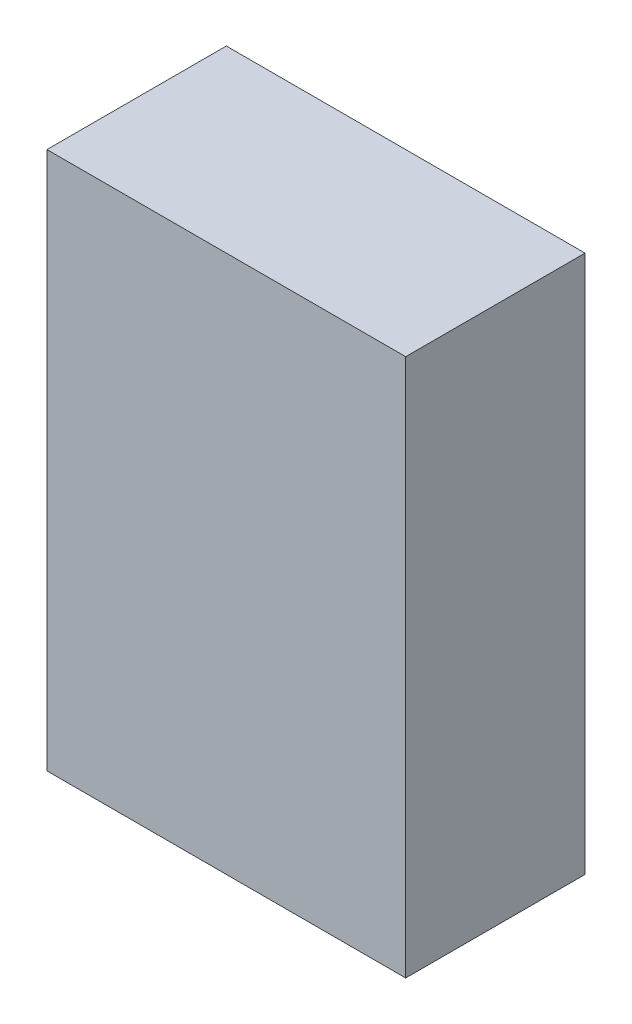
ISO-10303-21;
HEADER;
FILE_DESCRIPTION(('STEP AP214'),'2;1');
FILE_NAME('part.step','',(''),(''),'','','');
FILE_SCHEMA(('AUTOMOTIVE_DESIGN { 1 0 10303 214 1 1 1 1 }'));
ENDSEC;
DATA;
#1=APPLICATION_CONTEXT('core data for automotive mechanical design processes');
#2=APPLICATION_PROTOCOL_DEFINITION('international standard','automotive_design',2000,#1);
#3=PRODUCT_CONTEXT('',#1,'mechanical');
#4=PRODUCT('Part','Part','',(#3));
#5=PRODUCT_RELATED_PRODUCT_CATEGORY('part','',(#4));
#6=PRODUCT_DEFINITION_FORMATION('','',#4);
#7=PRODUCT_DEFINITION_CONTEXT('part definition',#1,'design');
#8=PRODUCT_DEFINITION('design','',#6,#7);
#9=PRODUCT_DEFINITION_SHAPE('','',#8);
#10=(LENGTH_UNIT() NAMED_UNIT(*) SI_UNIT(.MILLI.,.METRE.));
#11=(NAMED_UNIT(*) PLANE_ANGLE_UNIT() SI_UNIT($,.RADIAN.));
#12=(NAMED_UNIT(*) SI_UNIT($,.STERADIAN.) SOLID_ANGLE_UNIT());
#13=UNCERTAINTY_MEASURE_WITH_UNIT(LENGTH_MEASURE(1.E-05),#10,'distance_accuracy_value','');
#14=(GEOMETRIC_REPRESENTATION_CONTEXT(3) GLOBAL_UNCERTAINTY_ASSIGNED_CONTEXT((#13)) GLOBAL_UNIT_ASSIGNED_CONTEXT((#10,
#11,#12)) REPRESENTATION_CONTEXT('',''));
#15=CARTESIAN_POINT('',(0.,0.,0.));
#16=DIRECTION('',(0.,0.,1.));
#17=DIRECTION('',(1.,0.,0.));
#18=AXIS2_PLACEMENT_3D('',#15,#16,#17);
#19=CARTESIAN_POINT('',(-14.6332985749044,14.014598540146,10.));
#20=DIRECTION('',(1.,0.,0.));
#21=DIRECTION('',(0.,0.,-1.));
#22=AXIS2_PLACEMENT_3D('',#19,#20,#21);
#23=PLANE('',#22);
#24=DIRECTION('',(0.,-1.,0.));
#25=VECTOR('',#24,1.);
#26=CARTESIAN_POINT('',(-14.6332985749044,14.014598540146,0.));
#27=LINE('',#26,#25);
#28=CARTESIAN_POINT('',(-14.6332985749044,14.014598540146,0.));
#29=VERTEX_POINT('',#28);
#30=CARTESIAN_POINT('',(-14.6332985749044,-15.985401459854,0.));
#31=VERTEX_POINT('',#30);
#32=EDGE_CURVE('E98',#29,#31,#27,.T.);
#33=ORIENTED_EDGE('',*,*,#32,.T.);
#34=DIRECTION('',(0.,0.,-1.));
#35=VECTOR('',#34,1.);
#36=CARTESIAN_POINT('',(-14.6332985749044,-15.985401459854,10.));
#37=LINE('',#36,#35);
#38=CARTESIAN_POINT('',(-14.6332985749044,-15.985401459854,10.));
#39=VERTEX_POINT('',#38);
#40=EDGE_CURVE('E11',#39,#31,#37,.T.);
#41=ORIENTED_EDGE('',*,*,#40,.F.);
#42=DIRECTION('',(0.,-1.,0.));
#43=VECTOR('',#42,1.);
#44=CARTESIAN_POINT('',(-14.6332985749044,14.014598540146,10.));
#45=LINE('',#44,#43);
#46=CARTESIAN_POINT('',(-14.6332985749044,14.014598540146,10.));
#47=VERTEX_POINT('',#46);
#48=EDGE_CURVE('E86',#47,#39,#45,.T.);
#49=ORIENTED_EDGE('',*,*,#48,.F.);
#50=DIRECTION('',(0.,0.,-1.));
#51=VECTOR('',#50,1.);
#52=CARTESIAN_POINT('',(-14.6332985749044,14.014598540146,10.));
#53=LINE('',#52,#51);
#54=EDGE_CURVE('E94',#47,#29,#53,.T.);
#55=ORIENTED_EDGE('',*,*,#54,.T.);
#56=EDGE_LOOP('',(#33,#41,#49,#55));
#57=FACE_BOUND('',#56,.T.);
#58=ADVANCED_FACE('F35',(#57),#23,.F.);
#59=CARTESIAN_POINT('',(-14.6332985749044,-15.985401459854,10.));
#60=DIRECTION('',(0.,1.,0.));
#61=DIRECTION('',(0.,0.,1.));
#62=AXIS2_PLACEMENT_3D('',#59,#60,#61);
#63=PLANE('',#62);
#64=DIRECTION('',(1.,0.,0.));
#65=VECTOR('',#64,1.);
#66=CARTESIAN_POINT('',(-14.6332985749044,-15.985401459854,0.));
#67=LINE('',#66,#65);
#68=CARTESIAN_POINT('',(5.36670142509557,-15.985401459854,0.));
#69=VERTEX_POINT('',#68);
#70=EDGE_CURVE('E90',#31,#69,#67,.T.);
#71=ORIENTED_EDGE('',*,*,#70,.T.);
#72=DIRECTION('',(0.,0.,-1.));
#73=VECTOR('',#72,1.);
#74=CARTESIAN_POINT('',(5.36670142509557,-15.985401459854,10.));
#75=LINE('',#74,#73);
#76=CARTESIAN_POINT('',(5.36670142509557,-15.985401459854,10.));
#77=VERTEX_POINT('',#76);
#78=EDGE_CURVE('E43',#77,#69,#75,.T.);
#79=ORIENTED_EDGE('',*,*,#78,.F.);
#80=DIRECTION('',(1.,0.,0.));
#81=VECTOR('',#80,1.);
#82=CARTESIAN_POINT('',(-14.6332985749044,-15.985401459854,10.));
#83=LINE('',#82,#81);
#84=EDGE_CURVE('E81',#39,#77,#83,.T.);
#85=ORIENTED_EDGE('',*,*,#84,.F.);
#86=ORIENTED_EDGE('',*,*,#40,.T.);
#87=EDGE_LOOP('',(#71,#79,#85,#86));
#88=FACE_BOUND('',#87,.T.);
#89=ADVANCED_FACE('F89',(#88),#63,.F.);
#90=CARTESIAN_POINT('',(5.36670142509557,14.014598540146,10.));
#91=DIRECTION('',(-1.,0.,0.));
#92=DIRECTION('',(0.,0.,1.));
#93=AXIS2_PLACEMENT_3D('',#90,#91,#92);
#94=PLANE('',#93);
#95=DIRECTION('',(0.,1.,0.));
#96=VECTOR('',#95,1.);
#97=CARTESIAN_POINT('',(5.36670142509557,14.014598540146,0.));
#98=LINE('',#97,#96);
#99=CARTESIAN_POINT('',(5.36670142509557,14.014598540146,0.));
#100=VERTEX_POINT('',#99);
#101=EDGE_CURVE('E68',#69,#100,#98,.T.);
#102=ORIENTED_EDGE('',*,*,#101,.T.);
#103=DIRECTION('',(0.,0.,-1.));
#104=VECTOR('',#103,1.);
#105=CARTESIAN_POINT('',(5.36670142509557,14.014598540146,10.));
#106=LINE('',#105,#104);
#107=CARTESIAN_POINT('',(5.36670142509557,14.014598540146,10.));
#108=VERTEX_POINT('',#107);
#109=EDGE_CURVE('E91',#108,#100,#106,.T.);
#110=ORIENTED_EDGE('',*,*,#109,.F.);
#111=DIRECTION('',(0.,1.,0.));
#112=VECTOR('',#111,1.);
#113=CARTESIAN_POINT('',(5.36670142509557,14.014598540146,10.));
#114=LINE('',#113,#112);
#115=EDGE_CURVE('E84',#77,#108,#114,.T.);
#116=ORIENTED_EDGE('',*,*,#115,.F.);
#117=ORIENTED_EDGE('',*,*,#78,.T.);
#118=EDGE_LOOP('',(#102,#110,#116,#117));
#119=FACE_BOUND('',#118,.T.);
#120=ADVANCED_FACE('F92',(#119),#94,.F.);
#121=CARTESIAN_POINT('',(-14.6332985749044,14.014598540146,10.));
#122=DIRECTION('',(0.,-1.,0.));
#123=DIRECTION('',(1.,0.,0.));
#124=AXIS2_PLACEMENT_3D('',#121,#122,#123);
#125=PLANE('',#124);
#126=DIRECTION('',(-1.,0.,0.));
#127=VECTOR('',#126,1.);
#128=CARTESIAN_POINT('',(-14.6332985749044,14.014598540146,0.));
#129=LINE('',#128,#127);
#130=EDGE_CURVE('E74',#100,#29,#129,.T.);
#131=ORIENTED_EDGE('',*,*,#130,.T.);
#132=ORIENTED_EDGE('',*,*,#54,.F.);
#133=DIRECTION('',(-1.,0.,0.));
#134=VECTOR('',#133,1.);
#135=CARTESIAN_POINT('',(-14.6332985749044,14.014598540146,10.));
#136=LINE('',#135,#134);
#137=EDGE_CURVE('E51',#108,#47,#136,.T.);
#138=ORIENTED_EDGE('',*,*,#137,.F.);
#139=ORIENTED_EDGE('',*,*,#109,.T.);
#140=EDGE_LOOP('',(#131,#132,#138,#139));
#141=FACE_BOUND('',#140,.T.);
#142=ADVANCED_FACE('F105',(#141),#125,.F.);
#143=CARTESIAN_POINT('',(0.,0.,10.));
#144=DIRECTION('',(0.,0.,1.));
#145=DIRECTION('',(1.,0.,0.));
#146=AXIS2_PLACEMENT_3D('',#143,#144,#145);
#147=PLANE('',#146);
#148=ORIENTED_EDGE('',*,*,#48,.T.);
#149=ORIENTED_EDGE('',*,*,#84,.T.);
#150=ORIENTED_EDGE('',*,*,#115,.T.);
#151=ORIENTED_EDGE('',*,*,#137,.T.);
#152=EDGE_LOOP('',(#148,#149,#150,#151));
#153=FACE_BOUND('',#152,.T.);
#154=ADVANCED_FACE('F82',(#153),#147,.T.);
#155=CARTESIAN_POINT('',(0.,0.,0.));
#156=DIRECTION('',(0.,0.,1.));
#157=DIRECTION('',(1.,0.,0.));
#158=AXIS2_PLACEMENT_3D('',#155,#156,#157);
#159=PLANE('',#158);
#160=ORIENTED_EDGE('',*,*,#32,.F.);
#161=ORIENTED_EDGE('',*,*,#130,.F.);
#162=ORIENTED_EDGE('',*,*,#101,.F.);
#163=ORIENTED_EDGE('',*,*,#70,.F.);
#164=EDGE_LOOP('',(#160,#161,#162,#163));
#165=FACE_BOUND('',#164,.T.);
#166=ADVANCED_FACE('F108',(#165),#159,.F.);
#167=CLOSED_SHELL('',(#58,#89,#120,#142,#154,#166));
#168=MANIFOLD_SOLID_BREP('B2',#167);
#169=ADVANCED_BREP_SHAPE_REPRESENTATION('',(#18,#168),#14);
#170=SHAPE_DEFINITION_REPRESENTATION(#9,#169);
ENDSEC;
END-ISO-10303-21;
